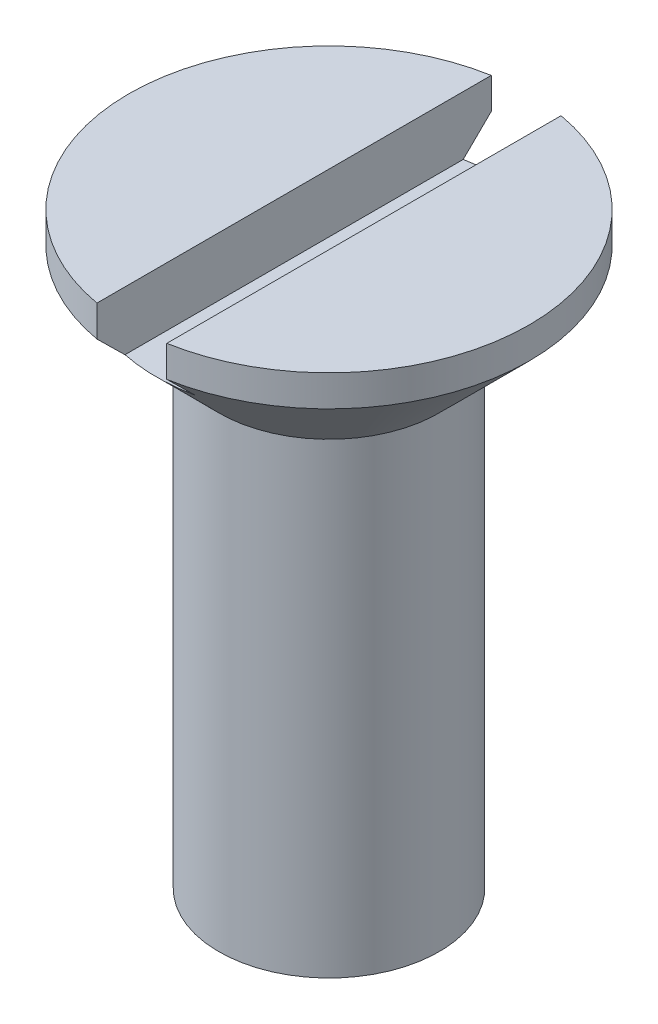
ISO-10303-21;
HEADER;
FILE_DESCRIPTION(('STEP AP214'),'2;1');
FILE_NAME('part.step','',(''),(''),'','','');
FILE_SCHEMA(('AUTOMOTIVE_DESIGN { 1 0 10303 214 1 1 1 1 }'));
ENDSEC;
DATA;
#1=APPLICATION_CONTEXT('core data for automotive mechanical design processes');
#2=APPLICATION_PROTOCOL_DEFINITION('international standard','automotive_design',2000,#1);
#3=PRODUCT_CONTEXT('',#1,'mechanical');
#4=PRODUCT('Part','Part','',(#3));
#5=PRODUCT_RELATED_PRODUCT_CATEGORY('part','',(#4));
#6=PRODUCT_DEFINITION_FORMATION('','',#4);
#7=PRODUCT_DEFINITION_CONTEXT('part definition',#1,'design');
#8=PRODUCT_DEFINITION('design','',#6,#7);
#9=PRODUCT_DEFINITION_SHAPE('','',#8);
#10=(LENGTH_UNIT() NAMED_UNIT(*) SI_UNIT(.MILLI.,.METRE.));
#11=(NAMED_UNIT(*) PLANE_ANGLE_UNIT() SI_UNIT($,.RADIAN.));
#12=(NAMED_UNIT(*) SI_UNIT($,.STERADIAN.) SOLID_ANGLE_UNIT());
#13=UNCERTAINTY_MEASURE_WITH_UNIT(LENGTH_MEASURE(1.E-05),#10,'distance_accuracy_value','');
#14=(GEOMETRIC_REPRESENTATION_CONTEXT(3) GLOBAL_UNCERTAINTY_ASSIGNED_CONTEXT((#13)) GLOBAL_UNIT_ASSIGNED_CONTEXT((#10,
#11,#12)) REPRESENTATION_CONTEXT('',''));
#15=CARTESIAN_POINT('',(0.,0.,0.));
#16=DIRECTION('',(0.,0.,1.));
#17=DIRECTION('',(1.,0.,0.));
#18=AXIS2_PLACEMENT_3D('',#15,#16,#17);
#19=CARTESIAN_POINT('',(0.,16.,0.));
#20=DIRECTION('',(0.,1.,0.));
#21=DIRECTION('',(-1.,0.,0.));
#22=AXIS2_PLACEMENT_3D('',#19,#20,#21);
#23=CYLINDRICAL_SURFACE('',#22,5.45);
#24=DIRECTION('',(0.,1.,0.));
#25=VECTOR('',#24,1.);
#26=CARTESIAN_POINT('',(-0.95,16.,5.3665631459995));
#27=LINE('',#26,#25);
#28=CARTESIAN_POINT('',(-0.95,16.,5.3665631459995));
#29=VERTEX_POINT('',#28);
#30=CARTESIAN_POINT('',(-0.95,15.15,5.3665631459995));
#31=VERTEX_POINT('',#30);
#32=EDGE_CURVE('E129',#29,#31,#27,.F.);
#33=ORIENTED_EDGE('',*,*,#32,.F.);
#34=CARTESIAN_POINT('',(0.,16.,0.));
#35=DIRECTION('',(0.,1.,0.));
#36=DIRECTION('',(-1.,0.,0.));
#37=AXIS2_PLACEMENT_3D('',#34,#35,#36);
#38=CIRCLE('',#37,5.45);
#39=CARTESIAN_POINT('',(-0.95,16.,-5.3665631459995));
#40=VERTEX_POINT('',#39);
#41=EDGE_CURVE('E120',#40,#29,#38,.T.);
#42=ORIENTED_EDGE('',*,*,#41,.F.);
#43=DIRECTION('',(0.,1.,0.));
#44=VECTOR('',#43,1.);
#45=CARTESIAN_POINT('',(-0.95,16.,-5.3665631459995));
#46=LINE('',#45,#44);
#47=CARTESIAN_POINT('',(-0.95,15.15,-5.3665631459995));
#48=VERTEX_POINT('',#47);
#49=EDGE_CURVE('E165',#48,#40,#46,.T.);
#50=ORIENTED_EDGE('',*,*,#49,.F.);
#51=CARTESIAN_POINT('',(0.,15.15,0.));
#52=DIRECTION('',(0.,1.,0.));
#53=DIRECTION('',(-1.,0.,0.));
#54=AXIS2_PLACEMENT_3D('',#51,#52,#53);
#55=CIRCLE('',#54,5.45);
#56=EDGE_CURVE('E119',#48,#31,#55,.T.);
#57=ORIENTED_EDGE('',*,*,#56,.T.);
#58=EDGE_LOOP('',(#33,#42,#50,#57));
#59=FACE_BOUND('',#58,.T.);
#60=ADVANCED_FACE('F45',(#59),#23,.T.);
#61=CARTESIAN_POINT('',(0.,16.,0.));
#62=DIRECTION('',(0.,1.,0.));
#63=DIRECTION('',(-1.,0.,0.));
#64=AXIS2_PLACEMENT_3D('',#61,#62,#63);
#65=PLANE('',#64);
#66=DIRECTION('',(0.,0.,1.));
#67=VECTOR('',#66,1.);
#68=CARTESIAN_POINT('',(-0.95,16.,0.));
#69=LINE('',#68,#67);
#70=EDGE_CURVE('E104',#40,#29,#69,.T.);
#71=ORIENTED_EDGE('',*,*,#70,.F.);
#72=ORIENTED_EDGE('',*,*,#41,.T.);
#73=EDGE_LOOP('',(#71,#72));
#74=FACE_BOUND('',#73,.T.);
#75=ADVANCED_FACE('F184',(#74),#65,.T.);
#76=CARTESIAN_POINT('',(0.,0.,0.));
#77=DIRECTION('',(0.,1.,0.));
#78=DIRECTION('',(-1.,0.,0.));
#79=AXIS2_PLACEMENT_3D('',#76,#77,#78);
#80=CONICAL_SURFACE('',#79,3.,1.04719755119659);
#81=CARTESIAN_POINT('',(0.,-1.7320508075689,0.));
#82=VERTEX_POINT('',#81);
#83=VERTEX_LOOP('',#82);
#84=FACE_BOUND('',#83,.T.);
#85=CARTESIAN_POINT('',(0.,0.,0.));
#86=DIRECTION('',(0.,1.,0.));
#87=DIRECTION('',(-1.,0.,0.));
#88=AXIS2_PLACEMENT_3D('',#85,#86,#87);
#89=CIRCLE('',#88,3.);
#90=CARTESIAN_POINT('',(-3.,0.,0.));
#91=VERTEX_POINT('',#90);
#92=EDGE_CURVE('E105',#91,#91,#89,.T.);
#93=ORIENTED_EDGE('',*,*,#92,.F.);
#94=EDGE_LOOP('',(#93));
#95=FACE_BOUND('',#94,.T.);
#96=ADVANCED_FACE('F47',(#84,#95),#80,.T.);
#97=CARTESIAN_POINT('',(0.,16.,0.));
#98=DIRECTION('',(0.,1.,0.));
#99=DIRECTION('',(-1.,0.,0.));
#100=AXIS2_PLACEMENT_3D('',#97,#98,#99);
#101=CYLINDRICAL_SURFACE('',#100,3.);
#102=ORIENTED_EDGE('',*,*,#92,.T.);
#103=EDGE_LOOP('',(#102));
#104=FACE_BOUND('',#103,.T.);
#105=CARTESIAN_POINT('',(0.,12.7,0.));
#106=DIRECTION('',(0.,1.,0.));
#107=DIRECTION('',(-1.,0.,0.));
#108=AXIS2_PLACEMENT_3D('',#105,#106,#107);
#109=CIRCLE('',#108,3.);
#110=CARTESIAN_POINT('',(-3.,12.7,0.));
#111=VERTEX_POINT('',#110);
#112=EDGE_CURVE('E132',#111,#111,#109,.T.);
#113=ORIENTED_EDGE('',*,*,#112,.F.);
#114=EDGE_LOOP('',(#113));
#115=FACE_BOUND('',#114,.T.);
#116=ADVANCED_FACE('F189',(#104,#115),#101,.T.);
#117=CARTESIAN_POINT('',(0.,15.15,0.));
#118=DIRECTION('',(0.,1.,0.));
#119=DIRECTION('',(-1.,0.,0.));
#120=AXIS2_PLACEMENT_3D('',#117,#118,#119);
#121=CONICAL_SURFACE('',#120,5.45,0.785398163397443);
#122=CARTESIAN_POINT('',(-0.95,15.1507,5.36727402784691));
#123=CARTESIAN_POINT('',(-0.95,15.0066414645828,5.22096942686692));
#124=CARTESIAN_POINT('',(-0.95,14.8626670090981,5.07458190529039));
#125=CARTESIAN_POINT('',(-0.95,14.5748101059668,4.78142879407387));
#126=CARTESIAN_POINT('',(-0.95,14.4309278942986,4.63466297275421));
#127=CARTESIAN_POINT('',(-0.95,14.1409084092543,4.33821736729773));
#128=CARTESIAN_POINT('',(-0.95,13.9947766015238,4.18853223049865));
#129=CARTESIAN_POINT('',(-0.95,13.703095971748,3.88888624809528));
#130=CARTESIAN_POINT('',(-0.95,13.5575467133769,3.73892582684176));
#131=CARTESIAN_POINT('',(-0.95,13.184143155379,3.35268732026555));
#132=CARTESIAN_POINT('',(-0.95,12.9567216786612,3.11598875256884));
#133=CARTESIAN_POINT('',(-0.95,12.6172653560709,2.75849636400409));
#134=CARTESIAN_POINT('',(-0.950000000000001,12.5041829404961,2.63869876965932));
#135=CARTESIAN_POINT('',(-0.950000000000001,12.279122950606,2.39816357821468));
#136=CARTESIAN_POINT('',(-0.950000000000001,12.1671449310138,2.27742639827609));
#137=CARTESIAN_POINT('',(-0.950000000000001,11.9464813770811,2.03630430512403));
#138=CARTESIAN_POINT('',(-0.95,11.8377716601376,1.91594166741529));
#139=CARTESIAN_POINT('',(-0.950000000000001,11.6765899716622,1.73355249406454));
#140=CARTESIAN_POINT('',(-0.950000000000001,11.6231332919473,1.67239741852465));
#141=CARTESIAN_POINT('',(-0.950000000000001,11.5171142480341,1.54931822073711));
#142=CARTESIAN_POINT('',(-0.950000000000001,11.4645518520347,1.4873941259721));
#143=CARTESIAN_POINT('',(-0.950000000000001,11.3610106756752,1.3629529877671));
#144=CARTESIAN_POINT('',(-0.950000000000001,11.3100234789139,1.30044297031366));
#145=CARTESIAN_POINT('',(-0.950000000000001,11.2097768557509,1.17405781364908));
#146=CARTESIAN_POINT('',(-0.950000000000001,11.1605171425635,1.11018290388926));
#147=CARTESIAN_POINT('',(-0.950000000000001,11.0646842233115,0.980693167144415));
#148=CARTESIAN_POINT('',(-0.950000000000001,11.018104441057,0.915083231273144));
#149=CARTESIAN_POINT('',(-0.950000000000001,10.9289406266786,0.781218199399258));
#150=CARTESIAN_POINT('',(-0.950000000000001,10.8863524092791,0.712965982498648));
#151=CARTESIAN_POINT('',(-0.950000000000001,10.8383458219484,0.627290830226433));
#152=CARTESIAN_POINT('',(-0.950000000000001,10.8297832206589,0.611626968875244));
#153=CARTESIAN_POINT('',(-0.950000000000001,10.813029231131,0.580097704625373));
#154=CARTESIAN_POINT('',(-0.950000000000001,10.804837925926,0.564232257651597));
#155=CARTESIAN_POINT('',(-0.950000000000001,10.7808895294853,0.516321345769396));
#156=CARTESIAN_POINT('',(-0.950000000000001,10.7657564437722,0.483958640203387));
#157=CARTESIAN_POINT('',(-0.950000000000001,10.7377461184084,0.418661506764505));
#158=CARTESIAN_POINT('',(-0.950000000000001,10.724847057251,0.385736523552168));
#159=CARTESIAN_POINT('',(-0.950000000000001,10.7016315116072,0.318972916981181));
#160=CARTESIAN_POINT('',(-0.950000000000001,10.6913148961361,0.285134340057603));
#161=CARTESIAN_POINT('',(-0.950000000000001,10.6755998536932,0.223588326667059));
#162=CARTESIAN_POINT('',(-0.950000000000001,10.6696284392153,0.196027953954518));
#163=CARTESIAN_POINT('',(-0.950000000000001,10.6599469693575,0.14051514554449));
#164=CARTESIAN_POINT('',(-0.950000000000001,10.6562362385423,0.112562829505702));
#165=CARTESIAN_POINT('',(-0.950000000000001,10.6512689884953,0.0564821272998751));
#166=CARTESIAN_POINT('',(-0.950000000000001,10.650008484062,0.0283541018134348));
#167=CARTESIAN_POINT('',(-0.950000000000001,10.6499915683311,-0.027905465045656));
#168=CARTESIAN_POINT('',(-0.950000000000001,10.6512359798955,-0.0560370045371316));
#169=CARTESIAN_POINT('',(-0.950000000000001,10.6586455392972,-0.139905474855346));
#170=CARTESIAN_POINT('',(-0.950000000000001,10.6684666216025,-0.195353553361765));
#171=CARTESIAN_POINT('',(-0.950000000000001,10.689188398885,-0.276951858970863));
#172=CARTESIAN_POINT('',(-0.950000000000001,10.6971136013113,-0.303935870798542));
#173=CARTESIAN_POINT('',(-0.950000000000001,10.7146748611862,-0.357345323945094));
#174=CARTESIAN_POINT('',(-0.950000000000001,10.7243108584581,-0.383770784874284));
#175=CARTESIAN_POINT('',(-0.950000000000001,10.7636503552317,-0.483109331771262));
#176=CARTESIAN_POINT('',(-0.950000000000001,10.7982520801576,-0.554072842248655));
#177=CARTESIAN_POINT('',(-0.950000000000001,10.8741117655428,-0.692377095293874));
#178=CARTESIAN_POINT('',(-0.950000000000001,10.9153868206254,-0.75970792519422));
#179=CARTESIAN_POINT('',(-0.950000000000001,11.0023346103426,-0.892236746835649));
#180=CARTESIAN_POINT('',(-0.950000000000001,11.0480407691997,-0.957412601266825));
#181=CARTESIAN_POINT('',(-0.950000000000001,11.1185374399944,-1.05366873930195));
#182=CARTESIAN_POINT('',(-0.950000000000001,11.1423441800046,-1.08548396626285));
#183=CARTESIAN_POINT('',(-0.950000000000001,11.1905006808391,-1.14870022001976));
#184=CARTESIAN_POINT('',(-0.950000000000001,11.2148504230797,-1.18010126093262));
#185=CARTESIAN_POINT('',(-0.950000000000001,11.2953230201044,-1.28237587769292));
#186=CARTESIAN_POINT('',(-0.950000000000001,11.3523675591555,-1.3525232741423));
#187=CARTESIAN_POINT('',(-0.950000000000001,11.4679801194338,-1.49155447486917));
#188=CARTESIAN_POINT('',(-0.950000000000001,11.5265483162725,-1.56043813191835));
#189=CARTESIAN_POINT('',(-0.950000000000001,11.6447743313509,-1.69730257484197));
#190=CARTESIAN_POINT('',(-0.950000000000001,11.7044325111515,-1.76528304771262));
#191=CARTESIAN_POINT('',(-0.950000000000001,11.8245307259535,-1.90055074738839));
#192=CARTESIAN_POINT('',(-0.950000000000001,11.8849707792631,-1.96783795789366));
#193=CARTESIAN_POINT('',(-0.950000000000001,12.0673240017472,-2.16909659121553));
#194=CARTESIAN_POINT('',(-0.950000000000001,12.1901072719948,-2.30227879707876));
#195=CARTESIAN_POINT('',(-0.950000000000001,12.4370326196775,-2.56731989942241));
#196=CARTESIAN_POINT('',(-0.95,12.5611744145449,-2.69917906055064));
#197=CARTESIAN_POINT('',(-0.95,12.809781027783,-2.96141357028914));
#198=CARTESIAN_POINT('',(-0.95,12.9342415618214,-3.09179298391833));
#199=CARTESIAN_POINT('',(-0.95,13.1837912251014,-3.35196093172162));
#200=CARTESIAN_POINT('',(-0.95,13.3088803866407,-3.48174943486933));
#201=CARTESIAN_POINT('',(-0.95,13.6846560866124,-3.87032055879078));
#202=CARTESIAN_POINT('',(-0.95,13.9360010528692,-4.12846624524088));
#203=CARTESIAN_POINT('',(-0.95,14.2678444797129,-4.46799564927128));
#204=CARTESIAN_POINT('',(-0.95,14.3479036444104,-4.54981026078769));
#205=CARTESIAN_POINT('',(-0.95,14.508119094744,-4.71336230831203));
#206=CARTESIAN_POINT('',(-0.95,14.5882753902212,-4.7950997346887));
#207=CARTESIAN_POINT('',(-0.95,14.7487769343448,-4.95861796157241));
#208=CARTESIAN_POINT('',(-0.95,14.8291222894124,-5.04039865757632));
#209=CARTESIAN_POINT('',(-0.95,14.9898691554973,-5.20388671182276));
#210=CARTESIAN_POINT('',(-0.95,15.0702706591624,-5.28559407729382));
#211=CARTESIAN_POINT('',(-0.95,15.1507,-5.36727402784691));
#212=B_SPLINE_CURVE_WITH_KNOTS('',3,(#122,#123,#124,#125,#126,#127,#128,#129,#130,#131,#132,
#133,#134,#135,#136,#137,#138,#139,#140,#141,#142,#143,#144,#145,#146,#147,#148,#149,#150,#151,
#152,#153,#154,#155,#156,#157,#158,#159,#160,#161,#162,#163,#164,#165,#166,#167,#168,#169,#170,
#171,#172,#173,#174,#175,#176,#177,#178,#179,#180,#181,#182,#183,#184,#185,#186,#187,#188,#189,
#190,#191,#192,#193,#194,#195,#196,#197,#198,#199,#200,#201,#202,#203,#204,#205,#206,#207,#208,
#209,#210,#211),.UNSPECIFIED.,.F.,.F.,(4,2,2,2,2,2,2,2,2,2,2,2,2,2,2,2,2,2,2,2,2,2,2,2,2,2,2,2,
2,2,2,2,2,2,2,2,2,2,2,2,2,2,2,2,4),(0.,0.615971733476593,1.23255943239414,1.86012628446739,
2.48706670861859,3.47179557281988,3.96600953924989,4.46001535278202,4.94655187034505,
5.19022198069898,5.43388340786633,5.67586585560889,5.91780793896076,6.15912850734743,
6.4001931448015,6.45374310913537,6.50730499041662,6.61441955613181,6.72042026818556,
6.8264156026644,6.91093252340633,6.99542418022095,7.07977829915208,7.16416013283658,
7.33221931503605,7.4165513342557,7.50088038770464,7.73701700389003,7.97376838906795,
8.21246995736466,8.33167593620552,8.45087784155275,8.72208373607497,8.99332102854833,
9.26464998888791,9.53598531416904,10.079398208818,10.622700146502,11.1634398873134,
11.7042077001593,12.7850905081255,13.1284969121904,13.4719416386942,13.8158763771414,
14.1597723411595),.UNSPECIFIED.);
#213=CARTESIAN_POINT('',(-0.95,14.4,4.60298815988048));
#214=VERTEX_POINT('',#213);
#215=EDGE_CURVE('E127',#31,#214,#212,.T.);
#216=ORIENTED_EDGE('',*,*,#215,.F.);
#217=ORIENTED_EDGE('',*,*,#56,.F.);
#218=CARTESIAN_POINT('',(-0.95,14.4,-4.60298815988048));
#219=VERTEX_POINT('',#218);
#220=EDGE_CURVE('E156',#219,#48,#212,.T.);
#221=ORIENTED_EDGE('',*,*,#220,.F.);
#222=CARTESIAN_POINT('',(0.,14.4,0.));
#223=DIRECTION('',(0.,-1.,0.));
#224=DIRECTION('',(0.,0.,-1.));
#225=AXIS2_PLACEMENT_3D('',#222,#223,#224);
#226=CIRCLE('',#225,4.69999999999998);
#227=CARTESIAN_POINT('',(0.95,14.4,-4.60298815988048));
#228=VERTEX_POINT('',#227);
#229=EDGE_CURVE('E49',#228,#219,#226,.F.);
#230=ORIENTED_EDGE('',*,*,#229,.F.);
#231=CARTESIAN_POINT('',(0.95,15.1507,-5.36727402784691));
#232=CARTESIAN_POINT('',(0.95,15.0066414645828,-5.22096942686692));
#233=CARTESIAN_POINT('',(0.95,14.8626670090981,-5.07458190529039));
#234=CARTESIAN_POINT('',(0.95,14.5748101059668,-4.78142879407387));
#235=CARTESIAN_POINT('',(0.95,14.4309278942986,-4.63466297275422));
#236=CARTESIAN_POINT('',(0.95,14.1409084092543,-4.33821736729774));
#237=CARTESIAN_POINT('',(0.95,13.9947766015238,-4.18853223049866));
#238=CARTESIAN_POINT('',(0.95,13.703095971748,-3.88888624809529));
#239=CARTESIAN_POINT('',(0.95,13.5575467133769,-3.73892582684178));
#240=CARTESIAN_POINT('',(0.95,13.1841431553791,-3.35268732026556));
#241=CARTESIAN_POINT('',(0.95,12.9567216786612,-3.11598875256885));
#242=CARTESIAN_POINT('',(0.95,12.6172653560709,-2.7584963640041));
#243=CARTESIAN_POINT('',(0.950000000000001,12.5041829404961,-2.63869876965933));
#244=CARTESIAN_POINT('',(0.950000000000001,12.279122950606,-2.39816357821469));
#245=CARTESIAN_POINT('',(0.950000000000001,12.1671449310138,-2.2774263982761));
#246=CARTESIAN_POINT('',(0.950000000000001,11.9464813770811,-2.03630430512404));
#247=CARTESIAN_POINT('',(0.95,11.8377716601377,-1.9159416674153));
#248=CARTESIAN_POINT('',(0.950000000000001,11.6765899716622,-1.73355249406455));
#249=CARTESIAN_POINT('',(0.950000000000001,11.6231332919473,-1.67239741852465));
#250=CARTESIAN_POINT('',(0.950000000000001,11.5171142480341,-1.54931822073711));
#251=CARTESIAN_POINT('',(0.950000000000001,11.4645518520347,-1.48739412597211));
#252=CARTESIAN_POINT('',(0.950000000000001,11.3610106756752,-1.36295298776711));
#253=CARTESIAN_POINT('',(0.950000000000001,11.3100234789139,-1.30044297031367));
#254=CARTESIAN_POINT('',(0.950000000000001,11.2097768557509,-1.17405781364908));
#255=CARTESIAN_POINT('',(0.950000000000001,11.1605171425635,-1.11018290388926));
#256=CARTESIAN_POINT('',(0.950000000000001,11.0646842233115,-0.980693167144417));
#257=CARTESIAN_POINT('',(0.950000000000001,11.018104441057,-0.915083231273147));
#258=CARTESIAN_POINT('',(0.950000000000001,10.9289406266786,-0.781218199399259));
#259=CARTESIAN_POINT('',(0.950000000000001,10.8863524092791,-0.712965982498648));
#260=CARTESIAN_POINT('',(0.950000000000001,10.8383458219484,-0.627290830226434));
#261=CARTESIAN_POINT('',(0.950000000000001,10.8297832206589,-0.611626968875245));
#262=CARTESIAN_POINT('',(0.950000000000001,10.813029231131,-0.580097704625374));
#263=CARTESIAN_POINT('',(0.950000000000001,10.804837925926,-0.564232257651599));
#264=CARTESIAN_POINT('',(0.950000000000001,10.7808895294853,-0.516321345769398));
#265=CARTESIAN_POINT('',(0.950000000000001,10.7657564437722,-0.483958640203389));
#266=CARTESIAN_POINT('',(0.950000000000001,10.7377461184084,-0.418661506764507));
#267=CARTESIAN_POINT('',(0.950000000000001,10.724847057251,-0.38573652355217));
#268=CARTESIAN_POINT('',(0.950000000000001,10.7016315116072,-0.318972916981183));
#269=CARTESIAN_POINT('',(0.950000000000001,10.6913148961361,-0.285134340057605));
#270=CARTESIAN_POINT('',(0.950000000000001,10.6755998536932,-0.223588326667061));
#271=CARTESIAN_POINT('',(0.950000000000001,10.6696284392153,-0.19602795395452));
#272=CARTESIAN_POINT('',(0.950000000000001,10.6599469693575,-0.140515145544492));
#273=CARTESIAN_POINT('',(0.950000000000001,10.6562362385423,-0.112562829505704));
#274=CARTESIAN_POINT('',(0.950000000000001,10.6512689884953,-0.0564821272998769));
#275=CARTESIAN_POINT('',(0.950000000000001,10.650008484062,-0.0283541018134368));
#276=CARTESIAN_POINT('',(0.950000000000001,10.6499915683311,0.0279054650456538));
#277=CARTESIAN_POINT('',(0.950000000000001,10.6512359798955,0.0560370045371293));
#278=CARTESIAN_POINT('',(0.950000000000001,10.6586455392972,0.139905474855344));
#279=CARTESIAN_POINT('',(0.950000000000001,10.6684666216025,0.195353553361763));
#280=CARTESIAN_POINT('',(0.950000000000001,10.689188398885,0.276951858970861));
#281=CARTESIAN_POINT('',(0.950000000000001,10.6971136013113,0.30393587079854));
#282=CARTESIAN_POINT('',(0.950000000000001,10.7146748611862,0.357345323945092));
#283=CARTESIAN_POINT('',(0.950000000000001,10.7243108584581,0.383770784874282));
#284=CARTESIAN_POINT('',(0.950000000000001,10.7636503552317,0.483109331771258));
#285=CARTESIAN_POINT('',(0.950000000000001,10.7982520801576,0.554072842248649));
#286=CARTESIAN_POINT('',(0.950000000000001,10.8741117655427,0.692377095293867));
#287=CARTESIAN_POINT('',(0.950000000000001,10.9153868206254,0.759707925194212));
#288=CARTESIAN_POINT('',(0.950000000000001,11.0023346103426,0.892236746835641));
#289=CARTESIAN_POINT('',(0.950000000000001,11.0480407691997,0.957412601266815));
#290=CARTESIAN_POINT('',(0.950000000000001,11.1185374399944,1.05366873930194));
#291=CARTESIAN_POINT('',(0.950000000000001,11.1423441800046,1.08548396626284));
#292=CARTESIAN_POINT('',(0.950000000000001,11.1905006808391,1.14870022001975));
#293=CARTESIAN_POINT('',(0.950000000000001,11.2148504230796,1.18010126093261));
#294=CARTESIAN_POINT('',(0.950000000000001,11.2953230201044,1.28237587769291));
#295=CARTESIAN_POINT('',(0.950000000000001,11.3523675591555,1.35252327414228));
#296=CARTESIAN_POINT('',(0.950000000000001,11.4679801194338,1.49155447486916));
#297=CARTESIAN_POINT('',(0.950000000000001,11.5265483162725,1.56043813191833));
#298=CARTESIAN_POINT('',(0.950000000000001,11.6447743313509,1.69730257484196));
#299=CARTESIAN_POINT('',(0.950000000000001,11.7044325111515,1.7652830477126));
#300=CARTESIAN_POINT('',(0.950000000000001,11.8245307259535,1.90055074738837));
#301=CARTESIAN_POINT('',(0.950000000000001,11.8849707792631,1.96783795789365));
#302=CARTESIAN_POINT('',(0.950000000000001,12.0673240017471,2.16909659121551));
#303=CARTESIAN_POINT('',(0.950000000000001,12.1901072719948,2.30227879707875));
#304=CARTESIAN_POINT('',(0.950000000000001,12.4370326196775,2.56731989942239));
#305=CARTESIAN_POINT('',(0.95,12.5611744145448,2.69917906055062));
#306=CARTESIAN_POINT('',(0.95,12.809781027783,2.96141357028911));
#307=CARTESIAN_POINT('',(0.95,12.9342415618213,3.09179298391831));
#308=CARTESIAN_POINT('',(0.95,13.1837912251014,3.35196093172159));
#309=CARTESIAN_POINT('',(0.95,13.3088803866407,3.4817494348693));
#310=CARTESIAN_POINT('',(0.95,13.6846560866124,3.87032055879075));
#311=CARTESIAN_POINT('',(0.95,13.9360010528692,4.12846624524085));
#312=CARTESIAN_POINT('',(0.95,14.2678444797129,4.46799564927125));
#313=CARTESIAN_POINT('',(0.95,14.3479036444104,4.54981026078766));
#314=CARTESIAN_POINT('',(0.95,14.5081190947439,4.71336230831201));
#315=CARTESIAN_POINT('',(0.95,14.5882753902212,4.79509973468868));
#316=CARTESIAN_POINT('',(0.95,14.7487769343448,4.9586179615724));
#317=CARTESIAN_POINT('',(0.95,14.8291222894124,5.0403986575763));
#318=CARTESIAN_POINT('',(0.95,14.9898691554972,5.20388671182276));
#319=CARTESIAN_POINT('',(0.95,15.0702706591624,5.28559407729382));
#320=CARTESIAN_POINT('',(0.95,15.1507,5.36727402784691));
#321=B_SPLINE_CURVE_WITH_KNOTS('',3,(#231,#232,#233,#234,#235,#236,#237,#238,#239,#240,#241,
#242,#243,#244,#245,#246,#247,#248,#249,#250,#251,#252,#253,#254,#255,#256,#257,#258,#259,#260,
#261,#262,#263,#264,#265,#266,#267,#268,#269,#270,#271,#272,#273,#274,#275,#276,#277,#278,#279,
#280,#281,#282,#283,#284,#285,#286,#287,#288,#289,#290,#291,#292,#293,#294,#295,#296,#297,#298,
#299,#300,#301,#302,#303,#304,#305,#306,#307,#308,#309,#310,#311,#312,#313,#314,#315,#316,#317,
#318,#319,#320),.UNSPECIFIED.,.F.,.F.,(4,2,2,2,2,2,2,2,2,2,2,2,2,2,2,2,2,2,2,2,2,2,2,2,2,2,2,2,
2,2,2,2,2,2,2,2,2,2,2,2,2,2,2,2,4),(0.,0.615971733476588,1.23255943239413,1.86012628446738,
2.48706670861857,3.47179557281987,3.96600953924987,4.46001535278201,4.94655187034504,
5.19022198069897,5.43388340786632,5.67586585560889,5.91780793896075,6.15912850734742,
6.4001931448015,6.45374310913537,6.50730499041661,6.61441955613181,6.72042026818555,
6.8264156026644,6.91093252340633,6.99542418022095,7.07977829915207,7.16416013283658,
7.33221931503605,7.4165513342557,7.50088038770464,7.73701700389003,7.97376838906795,
8.21246995736465,8.33167593620551,8.45087784155274,8.72208373607496,8.99332102854831,
9.2646499888879,9.53598531416902,10.079398208818,10.622700146502,11.1634398873133,
11.7042077001592,12.7850905081255,13.1284969121904,13.4719416386942,13.8158763771414,
14.1597723411595),.UNSPECIFIED.);
#322=CARTESIAN_POINT('',(0.95,15.15,-5.3665631459995));
#323=VERTEX_POINT('',#322);
#324=EDGE_CURVE('E114',#323,#228,#321,.T.);
#325=ORIENTED_EDGE('',*,*,#324,.F.);
#326=CARTESIAN_POINT('',(0.95,15.15,5.3665631459995));
#327=VERTEX_POINT('',#326);
#328=EDGE_CURVE('E112',#327,#323,#55,.T.);
#329=ORIENTED_EDGE('',*,*,#328,.F.);
#330=CARTESIAN_POINT('',(0.95,14.4,4.60298815988048));
#331=VERTEX_POINT('',#330);
#332=EDGE_CURVE('E115',#331,#327,#321,.T.);
#333=ORIENTED_EDGE('',*,*,#332,.F.);
#334=EDGE_CURVE('E11',#214,#331,#226,.F.);
#335=ORIENTED_EDGE('',*,*,#334,.F.);
#336=EDGE_LOOP('',(#216,#217,#221,#230,#325,#329,#333,#335));
#337=FACE_BOUND('',#336,.T.);
#338=ORIENTED_EDGE('',*,*,#112,.T.);
#339=EDGE_LOOP('',(#338));
#340=FACE_BOUND('',#339,.T.);
#341=ADVANCED_FACE('F162',(#337,#340),#121,.T.);
#342=DIRECTION('',(0.,1.,0.));
#343=VECTOR('',#342,1.);
#344=CARTESIAN_POINT('',(0.95,16.,-5.3665631459995));
#345=LINE('',#344,#343);
#346=CARTESIAN_POINT('',(0.95,16.,-5.3665631459995));
#347=VERTEX_POINT('',#346);
#348=EDGE_CURVE('E98',#347,#323,#345,.F.);
#349=ORIENTED_EDGE('',*,*,#348,.F.);
#350=CARTESIAN_POINT('',(0.95,16.,5.3665631459995));
#351=VERTEX_POINT('',#350);
#352=EDGE_CURVE('E110',#351,#347,#38,.T.);
#353=ORIENTED_EDGE('',*,*,#352,.F.);
#354=DIRECTION('',(0.,1.,0.));
#355=VECTOR('',#354,1.);
#356=CARTESIAN_POINT('',(0.95,16.,5.3665631459995));
#357=LINE('',#356,#355);
#358=EDGE_CURVE('E61',#327,#351,#357,.T.);
#359=ORIENTED_EDGE('',*,*,#358,.F.);
#360=ORIENTED_EDGE('',*,*,#328,.T.);
#361=EDGE_LOOP('',(#349,#353,#359,#360));
#362=FACE_BOUND('',#361,.T.);
#363=ADVANCED_FACE('F109',(#362),#23,.T.);
#364=DIRECTION('',(0.,0.,-1.));
#365=VECTOR('',#364,1.);
#366=CARTESIAN_POINT('',(0.95,16.,0.));
#367=LINE('',#366,#365);
#368=EDGE_CURVE('E95',#351,#347,#367,.T.);
#369=ORIENTED_EDGE('',*,*,#368,.F.);
#370=ORIENTED_EDGE('',*,*,#352,.T.);
#371=EDGE_LOOP('',(#369,#370));
#372=FACE_BOUND('',#371,.T.);
#373=ADVANCED_FACE('F117',(#372),#65,.T.);
#374=CARTESIAN_POINT('',(-0.95,16.,-5.45));
#375=DIRECTION('',(-1.,0.,0.));
#376=DIRECTION('',(0.,-1.,0.));
#377=AXIS2_PLACEMENT_3D('',#374,#375,#376);
#378=PLANE('',#377);
#379=ORIENTED_EDGE('',*,*,#215,.T.);
#380=DIRECTION('',(0.,0.,1.));
#381=VECTOR('',#380,1.);
#382=CARTESIAN_POINT('',(-0.95,14.4,-5.45));
#383=LINE('',#382,#381);
#384=EDGE_CURVE('E149',#219,#214,#383,.T.);
#385=ORIENTED_EDGE('',*,*,#384,.F.);
#386=ORIENTED_EDGE('',*,*,#220,.T.);
#387=ORIENTED_EDGE('',*,*,#49,.T.);
#388=ORIENTED_EDGE('',*,*,#70,.T.);
#389=ORIENTED_EDGE('',*,*,#32,.T.);
#390=EDGE_LOOP('',(#379,#385,#386,#387,#388,#389));
#391=FACE_BOUND('',#390,.T.);
#392=ADVANCED_FACE('F155',(#391),#378,.F.);
#393=CARTESIAN_POINT('',(0.95,16.,-5.45));
#394=DIRECTION('',(1.,0.,0.));
#395=DIRECTION('',(0.,1.,0.));
#396=AXIS2_PLACEMENT_3D('',#393,#394,#395);
#397=PLANE('',#396);
#398=ORIENTED_EDGE('',*,*,#324,.T.);
#399=DIRECTION('',(0.,0.,1.));
#400=VECTOR('',#399,1.);
#401=CARTESIAN_POINT('',(0.95,14.4,-5.45));
#402=LINE('',#401,#400);
#403=EDGE_CURVE('E152',#228,#331,#402,.T.);
#404=ORIENTED_EDGE('',*,*,#403,.T.);
#405=ORIENTED_EDGE('',*,*,#332,.T.);
#406=ORIENTED_EDGE('',*,*,#358,.T.);
#407=ORIENTED_EDGE('',*,*,#368,.T.);
#408=ORIENTED_EDGE('',*,*,#348,.T.);
#409=EDGE_LOOP('',(#398,#404,#405,#406,#407,#408));
#410=FACE_BOUND('',#409,.T.);
#411=ADVANCED_FACE('F97',(#410),#397,.F.);
#412=CARTESIAN_POINT('',(-0.95,14.4,-5.45));
#413=DIRECTION('',(0.,-1.,0.));
#414=DIRECTION('',(0.,0.,-1.));
#415=AXIS2_PLACEMENT_3D('',#412,#413,#414);
#416=PLANE('',#415);
#417=ORIENTED_EDGE('',*,*,#334,.T.);
#418=ORIENTED_EDGE('',*,*,#403,.F.);
#419=ORIENTED_EDGE('',*,*,#229,.T.);
#420=ORIENTED_EDGE('',*,*,#384,.T.);
#421=EDGE_LOOP('',(#417,#418,#419,#420));
#422=FACE_BOUND('',#421,.T.);
#423=ADVANCED_FACE('F148',(#422),#416,.F.);
#424=CLOSED_SHELL('',(#60,#75,#96,#116,#341,#363,#373,#392,#411,#423));
#425=MANIFOLD_SOLID_BREP('B2',#424);
#426=ADVANCED_BREP_SHAPE_REPRESENTATION('',(#18,#425),#14);
#427=SHAPE_DEFINITION_REPRESENTATION(#9,#426);
ENDSEC;
END-ISO-10303-21;
